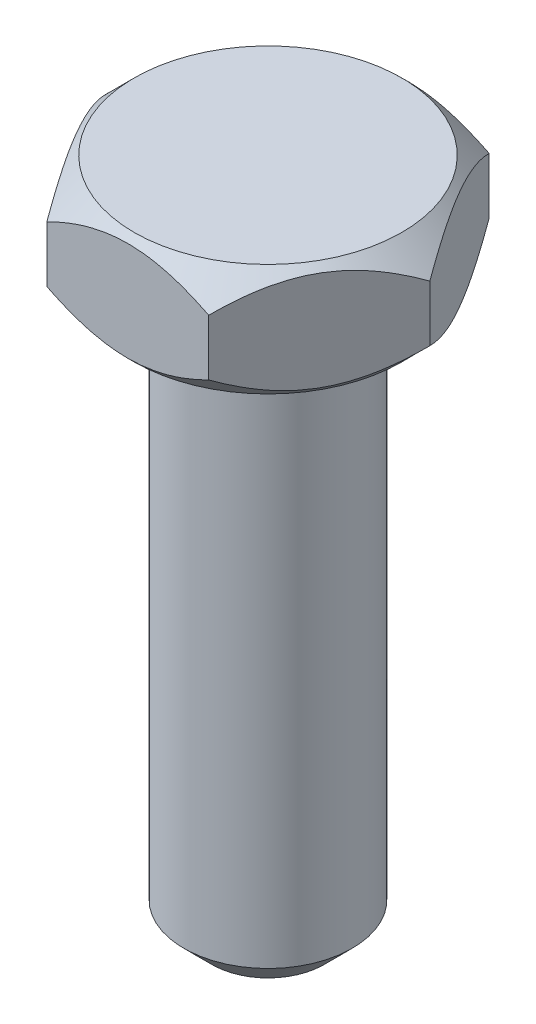
ISO-10303-21;
HEADER;
FILE_DESCRIPTION(('STEP AP214'),'2;1');
FILE_NAME('part.step','',(''),(''),'','','');
FILE_SCHEMA(('AUTOMOTIVE_DESIGN { 1 0 10303 214 1 1 1 1 }'));
ENDSEC;
DATA;
#1=APPLICATION_CONTEXT('core data for automotive mechanical design processes');
#2=APPLICATION_PROTOCOL_DEFINITION('international standard','automotive_design',2000,#1);
#3=PRODUCT_CONTEXT('',#1,'mechanical');
#4=PRODUCT('Part','Part','',(#3));
#5=PRODUCT_RELATED_PRODUCT_CATEGORY('part','',(#4));
#6=PRODUCT_DEFINITION_FORMATION('','',#4);
#7=PRODUCT_DEFINITION_CONTEXT('part definition',#1,'design');
#8=PRODUCT_DEFINITION('design','',#6,#7);
#9=PRODUCT_DEFINITION_SHAPE('','',#8);
#10=(LENGTH_UNIT() NAMED_UNIT(*) SI_UNIT(.MILLI.,.METRE.));
#11=(NAMED_UNIT(*) PLANE_ANGLE_UNIT() SI_UNIT($,.RADIAN.));
#12=(NAMED_UNIT(*) SI_UNIT($,.STERADIAN.) SOLID_ANGLE_UNIT());
#13=UNCERTAINTY_MEASURE_WITH_UNIT(LENGTH_MEASURE(1.E-05),#10,'distance_accuracy_value','');
#14=(GEOMETRIC_REPRESENTATION_CONTEXT(3) GLOBAL_UNCERTAINTY_ASSIGNED_CONTEXT((#13)) GLOBAL_UNIT_ASSIGNED_CONTEXT((#10,
#11,#12)) REPRESENTATION_CONTEXT('',''));
#15=CARTESIAN_POINT('',(0.,0.,0.));
#16=DIRECTION('',(0.,0.,1.));
#17=DIRECTION('',(1.,0.,0.));
#18=AXIS2_PLACEMENT_3D('',#15,#16,#17);
#19=CARTESIAN_POINT('',(-2.88675134594812,-4.,-4.99999999999999));
#20=DIRECTION('',(0.,-1.,0.));
#21=DIRECTION('',(0.,0.,-1.));
#22=AXIS2_PLACEMENT_3D('',#19,#20,#21);
#23=PLANE('',#22);
#24=CARTESIAN_POINT('',(0.,-4.,0.));
#25=DIRECTION('',(0.,1.,0.));
#26=DIRECTION('',(0.,0.,1.));
#27=AXIS2_PLACEMENT_3D('',#24,#25,#26);
#28=CIRCLE('',#27,4.77350269189625);
#29=CARTESIAN_POINT('',(0.,-4.,4.77350269189625));
#30=VERTEX_POINT('',#29);
#31=EDGE_CURVE('E101',#30,#30,#28,.T.);
#32=ORIENTED_EDGE('',*,*,#31,.F.);
#33=EDGE_LOOP('',(#32));
#34=FACE_BOUND('',#33,.T.);
#35=CARTESIAN_POINT('',(0.,-4.,0.));
#36=DIRECTION('',(0.,-1.,0.));
#37=DIRECTION('',(0.,0.,-1.));
#38=AXIS2_PLACEMENT_3D('',#35,#36,#37);
#39=CIRCLE('',#38,3.);
#40=CARTESIAN_POINT('',(0.,-4.,-3.));
#41=VERTEX_POINT('',#40);
#42=EDGE_CURVE('E115',#41,#41,#39,.T.);
#43=ORIENTED_EDGE('',*,*,#42,.F.);
#44=EDGE_LOOP('',(#43));
#45=FACE_BOUND('',#44,.T.);
#46=ADVANCED_FACE('F28',(#34,#45),#23,.T.);
#47=CARTESIAN_POINT('',(0.,-24.,0.));
#48=DIRECTION('',(0.,1.,0.));
#49=DIRECTION('',(0.,0.,1.));
#50=AXIS2_PLACEMENT_3D('',#47,#48,#49);
#51=CYLINDRICAL_SURFACE('',#50,3.);
#52=CARTESIAN_POINT('',(0.,-23.,0.));
#53=DIRECTION('',(0.,-1.,0.));
#54=DIRECTION('',(0.,0.,-1.));
#55=AXIS2_PLACEMENT_3D('',#52,#53,#54);
#56=CIRCLE('',#55,3.);
#57=CARTESIAN_POINT('',(0.,-23.,-3.));
#58=VERTEX_POINT('',#57);
#59=EDGE_CURVE('E41',#58,#58,#56,.F.);
#60=ORIENTED_EDGE('',*,*,#59,.T.);
#61=EDGE_LOOP('',(#60));
#62=FACE_BOUND('',#61,.T.);
#63=ORIENTED_EDGE('',*,*,#42,.T.);
#64=EDGE_LOOP('',(#63));
#65=FACE_BOUND('',#64,.T.);
#66=ADVANCED_FACE('F122',(#62,#65),#51,.T.);
#67=CARTESIAN_POINT('',(0.,-24.,0.));
#68=DIRECTION('',(0.,-1.,0.));
#69=DIRECTION('',(0.,0.,-1.));
#70=AXIS2_PLACEMENT_3D('',#67,#68,#69);
#71=PLANE('',#70);
#72=CARTESIAN_POINT('',(0.,-24.,0.));
#73=DIRECTION('',(0.,-1.,0.));
#74=DIRECTION('',(0.,0.,-1.));
#75=AXIS2_PLACEMENT_3D('',#72,#73,#74);
#76=CIRCLE('',#75,2.00000000000001);
#77=CARTESIAN_POINT('',(0.,-24.,-2.00000000000001));
#78=VERTEX_POINT('',#77);
#79=EDGE_CURVE('E116',#78,#78,#76,.T.);
#80=ORIENTED_EDGE('',*,*,#79,.T.);
#81=EDGE_LOOP('',(#80));
#82=FACE_BOUND('',#81,.T.);
#83=ADVANCED_FACE('F128',(#82),#71,.T.);
#84=CARTESIAN_POINT('',(0.,-24.,0.));
#85=DIRECTION('',(0.,1.,0.));
#86=DIRECTION('',(0.,0.,1.));
#87=AXIS2_PLACEMENT_3D('',#84,#85,#86);
#88=CONICAL_SURFACE('',#87,2.00000000000001,0.785398163397447);
#89=ORIENTED_EDGE('',*,*,#59,.F.);
#90=EDGE_LOOP('',(#89));
#91=FACE_BOUND('',#90,.T.);
#92=ORIENTED_EDGE('',*,*,#79,.F.);
#93=EDGE_LOOP('',(#92));
#94=FACE_BOUND('',#93,.T.);
#95=ADVANCED_FACE('F125',(#91,#94),#88,.T.);
#96=CARTESIAN_POINT('',(0.,-4.,0.));
#97=DIRECTION('',(0.,1.,0.));
#98=DIRECTION('',(0.,0.,1.));
#99=AXIS2_PLACEMENT_3D('',#96,#97,#98);
#100=CONICAL_SURFACE('',#99,4.77350269189625,0.785398163397448);
#101=CARTESIAN_POINT('',(-5.77361816195009,-2.99988452648213,0.000200000000039932));
#102=CARTESIAN_POINT('',(-5.72398176110225,-3.04951645439574,-0.0857727681732672));
#103=CARTESIAN_POINT('',(-5.6739638280717,-3.0976252747131,-0.172406369471769));
#104=CARTESIAN_POINT('',(-5.57309004377303,-3.19033336867022,-0.3471248890288));
#105=CARTESIAN_POINT('',(-5.52223375293569,-3.23493072549852,-0.435210568643571));
#106=CARTESIAN_POINT('',(-5.36782257743899,-3.36314092787175,-0.702658569860293));
#107=CARTESIAN_POINT('',(-5.26296050943971,-3.44062493449848,-0.884284999421792));
#108=CARTESIAN_POINT('',(-5.05149774994706,-3.57331105557449,-1.25054924277179));
#109=CARTESIAN_POINT('',(-4.94495110937142,-3.62884745935417,-1.43509343762457));
#110=CARTESIAN_POINT('',(-4.78337944338746,-3.69308950595249,-1.71494377217234));
#111=CARTESIAN_POINT('',(-4.72928433986568,-3.71131783666137,-1.80863923991277));
#112=CARTESIAN_POINT('',(-4.62063609179559,-3.74100781287389,-1.9968235257235));
#113=CARTESIAN_POINT('',(-4.56608301694085,-3.75247046969492,-2.09131222308102));
#114=CARTESIAN_POINT('',(-4.43314578685872,-3.77168913825403,-2.32156625980075));
#115=CARTESIAN_POINT('',(-4.35461839928598,-3.7757217117403,-2.4575796848624));
#116=CARTESIAN_POINT('',(-4.19770514602325,-3.7689541458947,-2.72936141189436));
#117=CARTESIAN_POINT('',(-4.11931933958609,-3.75814880702901,-2.86512961123579));
#118=CARTESIAN_POINT('',(-3.96328672226451,-3.72234235010197,-3.13538603207472));
#119=CARTESIAN_POINT('',(-3.88564083675503,-3.69732535604175,-3.26987265077581));
#120=CARTESIAN_POINT('',(-3.73168360440634,-3.63445567501058,-3.53653439939643));
#121=CARTESIAN_POINT('',(-3.65537215571136,-3.59660397223245,-3.66870970573533));
#122=CARTESIAN_POINT('',(-3.51990355411976,-3.51873011323948,-3.90334820652228));
#123=CARTESIAN_POINT('',(-3.4604464736886,-3.480755749581,-4.00633089069876));
#124=CARTESIAN_POINT('',(-3.34259967462161,-3.39868737382607,-4.21044753419214));
#125=CARTESIAN_POINT('',(-3.28420998845894,-3.35459317589646,-4.31158143726389));
#126=CARTESIAN_POINT('',(-3.16868188148908,-3.26127361464765,-4.51168198823795));
#127=CARTESIAN_POINT('',(-3.11154017495448,-3.21206438729062,-4.61065432718707));
#128=CARTESIAN_POINT('',(-2.99831490663731,-3.109160877157,-4.80676624461303));
#129=CARTESIAN_POINT('',(-2.94223072132828,-3.05546934545098,-4.90390690306937));
#130=CARTESIAN_POINT('',(-2.88663587589429,-2.99988452648214,-5.00019999999999));
#131=B_SPLINE_CURVE_WITH_KNOTS('',3,(#101,#102,#103,#104,#105,#106,#107,#108,#109,#110,#111,
#112,#113,#114,#115,#116,#117,#118,#119,#120,#121,#122,#123,#124,#125,#126,#127,#128,#129,#130),
.UNSPECIFIED.,.F.,.F.,(4,2,2,2,2,2,2,2,2,2,2,2,2,2,4),(0.,0.332945616209569,0.666071736106993,
1.33592065243335,1.99513262597482,2.32409207808825,2.65300234563692,3.12358963991984,
3.59434188052354,4.06562104077027,4.5368640704961,4.91117956742317,5.28550643319671,
5.65868635377117,6.03163889109475),.UNSPECIFIED.);
#132=CARTESIAN_POINT('',(-5.77350269189625,-3.,0.));
#133=VERTEX_POINT('',#132);
#134=CARTESIAN_POINT('',(-2.88675134594813,-3.,-4.99999999999999));
#135=VERTEX_POINT('',#134);
#136=EDGE_CURVE('E173',#133,#135,#131,.T.);
#137=ORIENTED_EDGE('',*,*,#136,.T.);
#138=CARTESIAN_POINT('',(-5.93336867910423,-1.0143233614403,-4.99999999999999));
#139=CARTESIAN_POINT('',(-5.78966341948587,-1.1241885817879,-4.99999999999999));
#140=CARTESIAN_POINT('',(-5.64517359422455,-1.23304389822759,-4.99999999999999));
#141=CARTESIAN_POINT('',(-5.35430787651161,-1.44827641705777,-4.99999999999999));
#142=CARTESIAN_POINT('',(-5.20793153723386,-1.55465301495845,-4.99999999999999));
#143=CARTESIAN_POINT('',(-4.9119053610751,-1.76522692025996,-4.99999999999999));
#144=CARTESIAN_POINT('',(-4.7622389674382,-1.86940102910427,-4.99999999999999));
#145=CARTESIAN_POINT('',(-4.4603979301907,-2.07403749362642,-4.99999999999999));
#146=CARTESIAN_POINT('',(-4.30822346176151,-2.17450010696542,-4.99999999999999));
#147=CARTESIAN_POINT('',(-3.99153933620166,-2.37689028562685,-4.99999999999999));
#148=CARTESIAN_POINT('',(-3.82684512877714,-2.47853053625136,-4.99999999999999));
#149=CARTESIAN_POINT('',(-3.49359569305951,-2.67537782448448,-4.99999999999999));
#150=CARTESIAN_POINT('',(-3.32503983391761,-2.77058380079454,-4.99999999999999));
#151=CARTESIAN_POINT('',(-2.98404180965613,-2.95252582018176,-4.99999999999999));
#152=CARTESIAN_POINT('',(-2.81161302726992,-3.03928674909056,-4.99999999999999));
#153=CARTESIAN_POINT('',(-2.4619377508861,-3.20239520740955,-4.99999999999999));
#154=CARTESIAN_POINT('',(-2.28469354573479,-3.27874758379917,-4.99999999999999));
#155=CARTESIAN_POINT('',(-1.94171568558995,-3.41181755173878,-4.99999999999999));
#156=CARTESIAN_POINT('',(-1.77643834256962,-3.46969922851381,-4.99999999999999));
#157=CARTESIAN_POINT('',(-1.44175059438624,-3.57222452709261,-4.99999999999999));
#158=CARTESIAN_POINT('',(-1.27233991994473,-3.61686728390092,-4.99999999999999));
#159=CARTESIAN_POINT('',(-0.933301891878295,-3.68978435588989,-4.99999999999999));
#160=CARTESIAN_POINT('',(-0.763738295172394,-3.71835018807338,-4.99999999999999));
#161=CARTESIAN_POINT('',(-0.422603458667702,-3.75853073066782,-4.99999999999999));
#162=CARTESIAN_POINT('',(-0.251032616590633,-3.7701487436941,-4.99999999999999));
#163=CARTESIAN_POINT('',(0.0853406388539587,-3.77548648250807,-4.99999999999999));
#164=CARTESIAN_POINT('',(0.250131876658651,-3.76992113564033,-4.99999999999999));
#165=CARTESIAN_POINT('',(0.578387101858167,-3.74282076274746,-4.99999999999999));
#166=CARTESIAN_POINT('',(0.741850964252608,-3.72128424993436,-4.99999999999999));
#167=CARTESIAN_POINT('',(1.06903592592894,-3.66307865086045,-4.99999999999999));
#168=CARTESIAN_POINT('',(1.23270929845992,-3.62614570544629,-4.99999999999999));
#169=CARTESIAN_POINT('',(1.55646565066118,-3.53916921466345,-4.99999999999999));
#170=CARTESIAN_POINT('',(1.71654886698276,-3.48912653621913,-4.99999999999999));
#171=CARTESIAN_POINT('',(2.04376834721888,-3.37425220624934,-4.99999999999999));
#172=CARTESIAN_POINT('',(2.21062650526836,-3.30863700466564,-4.99999999999999));
#173=CARTESIAN_POINT('',(2.54003854131556,-3.16728810798752,-4.99999999999999));
#174=CARTESIAN_POINT('',(2.7025904176521,-3.0915498029936,-4.99999999999999));
#175=CARTESIAN_POINT('',(3.02416565802373,-2.9317524021677,-4.99999999999999));
#176=CARTESIAN_POINT('',(3.1831761026048,-2.84766751767455,-4.99999999999999));
#177=CARTESIAN_POINT('',(3.49754870709798,-2.67302987151769,-4.99999999999999));
#178=CARTESIAN_POINT('',(3.65291142946937,-2.58247811583028,-4.99999999999999));
#179=CARTESIAN_POINT('',(3.95285892432341,-2.40078159251411,-4.99999999999999));
#180=CARTESIAN_POINT('',(4.09759659911003,-2.30988790532247,-4.99999999999999));
#181=CARTESIAN_POINT('',(4.38458573992774,-2.12424528238796,-4.99999999999999));
#182=CARTESIAN_POINT('',(4.52683701776728,-2.02949605661616,-4.99999999999999));
#183=CARTESIAN_POINT('',(4.80803186770968,-1.83760520698688,-4.99999999999999));
#184=CARTESIAN_POINT('',(4.94699285705844,-1.74048901451515,-4.99999999999999));
#185=CARTESIAN_POINT('',(5.22301057132508,-1.54366358089935,-4.99999999999999));
#186=CARTESIAN_POINT('',(5.36006781033932,-1.44395506153837,-4.99999999999999));
#187=CARTESIAN_POINT('',(5.49632687048856,-1.34318580314552,-4.99999999999999));
#188=B_SPLINE_CURVE_WITH_KNOTS('',3,(#138,#139,#140,#141,#142,#143,#144,#145,#146,#147,#148,
#149,#150,#151,#152,#153,#154,#155,#156,#157,#158,#159,#160,#161,#162,#163,#164,#165,#166,#167,
#168,#169,#170,#171,#172,#173,#174,#175,#176,#177,#178,#179,#180,#181,#182,#183,#184,#185,#186,
#187),.UNSPECIFIED.,.F.,.F.,(4,2,2,2,2,2,2,2,2,2,2,2,2,2,2,2,2,2,2,2,2,2,2,2,4),(0.,
0.542683335711663,1.08549766009344,1.63250741832322,2.17947913015188,2.75996048819956,
3.34053736097748,3.91934802264124,4.49788822043794,5.02279153401111,5.54772913580436,
6.06281331680062,6.57779711011592,7.0716474990381,7.56554386725873,8.06827708076712,
8.57097705777059,9.10845041736518,9.6461693729829,10.1856047538602,10.7249564030361,
11.2376185039342,11.7503192408631,12.2588884723274,12.7673175877714),.UNSPECIFIED.);
#189=CARTESIAN_POINT('',(2.88675134594814,-3.,-4.99999999999999));
#190=VERTEX_POINT('',#189);
#191=EDGE_CURVE('E167',#135,#190,#188,.T.);
#192=ORIENTED_EDGE('',*,*,#191,.T.);
#193=CARTESIAN_POINT('',(2.8866358758943,-2.99988452648213,-5.00019999999999));
#194=CARTESIAN_POINT('',(2.93627227674214,-3.04951645439574,-4.91422723182668));
#195=CARTESIAN_POINT('',(2.98629020977269,-3.09762527471309,-4.82759363052818));
#196=CARTESIAN_POINT('',(3.08716399407136,-3.19033336867022,-4.65287511097115));
#197=CARTESIAN_POINT('',(3.1380202849087,-3.23493072549851,-4.56478943135638));
#198=CARTESIAN_POINT('',(3.2924314604054,-3.36314092787174,-4.29734143013966));
#199=CARTESIAN_POINT('',(3.39729352840468,-3.44062493449848,-4.11571500057816));
#200=CARTESIAN_POINT('',(3.60875628789733,-3.57331105557448,-3.74945075722817));
#201=CARTESIAN_POINT('',(3.71530292847297,-3.62884745935416,-3.56490656237539));
#202=CARTESIAN_POINT('',(3.87687459445693,-3.69308950595248,-3.28505622782762));
#203=CARTESIAN_POINT('',(3.93096969797871,-3.71131783666136,-3.1913607600872));
#204=CARTESIAN_POINT('',(4.03961794604879,-3.74100781287387,-3.00317647427646));
#205=CARTESIAN_POINT('',(4.09417102090353,-3.75247046969491,-2.90868777691894));
#206=CARTESIAN_POINT('',(4.22710825098566,-3.77168913825401,-2.67843374019922));
#207=CARTESIAN_POINT('',(4.30563563855841,-3.77572171174028,-2.54242031513757));
#208=CARTESIAN_POINT('',(4.46254889182113,-3.76895414589469,-2.2706385881056));
#209=CARTESIAN_POINT('',(4.5409346982583,-3.758148807029,-2.13487038876418));
#210=CARTESIAN_POINT('',(4.69696731557988,-3.72234235010196,-1.86461396792524));
#211=CARTESIAN_POINT('',(4.77461320108935,-3.69732535604173,-1.73012734922416));
#212=CARTESIAN_POINT('',(4.92857043343804,-3.63445567501056,-1.46346560060354));
#213=CARTESIAN_POINT('',(5.00488188213303,-3.59660397223244,-1.33129029426463));
#214=CARTESIAN_POINT('',(5.14035048372462,-3.51873011323946,-1.09665179347769));
#215=CARTESIAN_POINT('',(5.19980756415579,-3.48075574958098,-0.993669109301199));
#216=CARTESIAN_POINT('',(5.31765436322278,-3.39868737382605,-0.789552465807816));
#217=CARTESIAN_POINT('',(5.37604404938545,-3.35459317589644,-0.688418562736065));
#218=CARTESIAN_POINT('',(5.49157215635532,-3.26127361464763,-0.488318011762002));
#219=CARTESIAN_POINT('',(5.54871386288992,-3.2120643872906,-0.389345672812883));
#220=CARTESIAN_POINT('',(5.66193913120709,-3.10916087715698,-0.193233755386925));
#221=CARTESIAN_POINT('',(5.71802331651611,-3.05546934545096,-0.0960930969305828));
#222=CARTESIAN_POINT('',(5.77361816195011,-2.99988452648211,0.000200000000038399));
#223=B_SPLINE_CURVE_WITH_KNOTS('',3,(#193,#194,#195,#196,#197,#198,#199,#200,#201,#202,#203,
#204,#205,#206,#207,#208,#209,#210,#211,#212,#213,#214,#215,#216,#217,#218,#219,#220,#221,#222),
.UNSPECIFIED.,.F.,.F.,(4,2,2,2,2,2,2,2,2,2,2,2,2,2,4),(0.,0.332945616209567,0.666071736106988,
1.33592065243334,1.99513262597481,2.32409207808823,2.6530023456369,3.12358963991982,
3.59434188052352,4.06562104077025,4.53686407049609,4.91117956742316,5.2855064331967,
5.65868635377117,6.03163889109475),.UNSPECIFIED.);
#224=CARTESIAN_POINT('',(5.77350269189625,-3.,0.));
#225=VERTEX_POINT('',#224);
#226=EDGE_CURVE('E89',#190,#225,#223,.T.);
#227=ORIENTED_EDGE('',*,*,#226,.T.);
#228=CARTESIAN_POINT('',(5.77361816195011,-2.99988452648211,-0.000199999999961442));
#229=CARTESIAN_POINT('',(5.72398176110227,-3.04951645439572,0.0857727681733448));
#230=CARTESIAN_POINT('',(5.67396382807171,-3.09762527471308,0.172406369471846));
#231=CARTESIAN_POINT('',(5.57309004377305,-3.1903333686702,0.347124889028875));
#232=CARTESIAN_POINT('',(5.52223375293571,-3.23493072549849,0.435210568643645));
#233=CARTESIAN_POINT('',(5.36782257743901,-3.36314092787172,0.702658569860364));
#234=CARTESIAN_POINT('',(5.26296050943973,-3.44062493449846,0.884284999421861));
#235=CARTESIAN_POINT('',(5.05149774994707,-3.57331105557446,1.25054924277185));
#236=CARTESIAN_POINT('',(4.94495110937144,-3.62884745935414,1.43509343762464));
#237=CARTESIAN_POINT('',(4.78337944338747,-3.69308950595246,1.7149437721724));
#238=CARTESIAN_POINT('',(4.72928433986569,-3.71131783666134,1.80863923991283));
#239=CARTESIAN_POINT('',(4.62063609179561,-3.74100781287385,1.99682352572356));
#240=CARTESIAN_POINT('',(4.56608301694086,-3.75247046969489,2.09131222308108));
#241=CARTESIAN_POINT('',(4.43314578685873,-3.77168913825399,2.3215662598008));
#242=CARTESIAN_POINT('',(4.35461839928599,-3.77572171174026,2.45757968486245));
#243=CARTESIAN_POINT('',(4.19770514602326,-3.76895414589467,2.72936141189442));
#244=CARTESIAN_POINT('',(4.11931933958609,-3.75814880702898,2.86512961123584));
#245=CARTESIAN_POINT('',(3.96328672226451,-3.72234235010194,3.13538603207478));
#246=CARTESIAN_POINT('',(3.88564083675503,-3.69732535604171,3.26987265077586));
#247=CARTESIAN_POINT('',(3.73168360440634,-3.63445567501054,3.53653439939648));
#248=CARTESIAN_POINT('',(3.65537215571135,-3.59660397223242,3.66870970573539));
#249=CARTESIAN_POINT('',(3.51990355411976,-3.51873011323944,3.90334820652233));
#250=CARTESIAN_POINT('',(3.4604464736886,-3.48075574958096,4.00633089069881));
#251=CARTESIAN_POINT('',(3.34259967462161,-3.39868737382603,4.21044753419218));
#252=CARTESIAN_POINT('',(3.28420998845894,-3.35459317589643,4.31158143726393));
#253=CARTESIAN_POINT('',(3.16868188148908,-3.26127361464762,4.51168198823798));
#254=CARTESIAN_POINT('',(3.11154017495448,-3.21206438729059,4.6106543271871));
#255=CARTESIAN_POINT('',(2.99831490663731,-3.10916087715698,4.80676624461305));
#256=CARTESIAN_POINT('',(2.94223072132829,-3.05546934545097,4.90390690306938));
#257=CARTESIAN_POINT('',(2.8866358758943,-2.99988452648212,5.0002));
#258=B_SPLINE_CURVE_WITH_KNOTS('',3,(#228,#229,#230,#231,#232,#233,#234,#235,#236,#237,#238,
#239,#240,#241,#242,#243,#244,#245,#246,#247,#248,#249,#250,#251,#252,#253,#254,#255,#256,#257),
.UNSPECIFIED.,.F.,.F.,(4,2,2,2,2,2,2,2,2,2,2,2,2,2,4),(0.,0.332945616209566,0.666071736106988,
1.33592065243334,1.99513262597481,2.32409207808823,2.6530023456369,3.12358963991982,
3.59434188052352,4.06562104077025,4.53686407049609,4.91117956742315,5.28550643319668,
5.65868635377112,6.03163889109469),.UNSPECIFIED.);
#259=CARTESIAN_POINT('',(2.88675134594812,-3.,5.));
#260=VERTEX_POINT('',#259);
#261=EDGE_CURVE('E85',#225,#260,#258,.T.);
#262=ORIENTED_EDGE('',*,*,#261,.T.);
#263=CARTESIAN_POINT('',(-5.93336867913979,-1.01432336141309,5.));
#264=CARTESIAN_POINT('',(-5.78966341952042,-1.12418858176174,5.));
#265=CARTESIAN_POINT('',(-5.64517359425807,-1.23304389820249,5.));
#266=CARTESIAN_POINT('',(-5.35430787654308,-1.44827641703476,5.));
#267=CARTESIAN_POINT('',(-5.20793153726431,-1.55465301493648,5.));
#268=CARTESIAN_POINT('',(-4.91190536110345,-1.76522692024009,5.));
#269=CARTESIAN_POINT('',(-4.76223896746549,-1.86940102908545,5.));
#270=CARTESIAN_POINT('',(-4.46039793021584,-2.07403749360968,5.));
#271=CARTESIAN_POINT('',(-4.30822346178556,-2.17450010694972,5.));
#272=CARTESIAN_POINT('',(-3.99153933622337,-2.37689028561331,5.));
#273=CARTESIAN_POINT('',(-3.82684512879759,-2.47853053623893,5.));
#274=CARTESIAN_POINT('',(-3.49359569307741,-2.67537782447423,5.));
#275=CARTESIAN_POINT('',(-3.3250398339342,-2.77058380078537,5.));
#276=CARTESIAN_POINT('',(-2.98404180967006,-2.95252582017463,5.));
#277=CARTESIAN_POINT('',(-2.81161302728251,-3.0392867490844,5.));
#278=CARTESIAN_POINT('',(-2.46193775089592,-3.20239520740523,5.));
#279=CARTESIAN_POINT('',(-2.28469354574318,-3.2787475837957,5.));
#280=CARTESIAN_POINT('',(-1.94171568559774,-3.41181755173593,5.));
#281=CARTESIAN_POINT('',(-1.7764383425783,-3.46969922851087,5.));
#282=CARTESIAN_POINT('',(-1.44175059439672,-3.57222452708967,5.));
#283=CARTESIAN_POINT('',(-1.27233991995613,-3.61686728389806,5.));
#284=CARTESIAN_POINT('',(-0.933301891891501,-3.68978435588743,5.));
#285=CARTESIAN_POINT('',(-0.763738295186488,-3.71835018807121,5.));
#286=CARTESIAN_POINT('',(-0.422603458683547,-3.75853073066644,5.));
#287=CARTESIAN_POINT('',(-0.251032616607341,-3.77014874369322,5.));
#288=CARTESIAN_POINT('',(0.0853406388357404,-3.77548648250835,5.));
#289=CARTESIAN_POINT('',(0.250131876639783,-3.76992113564124,5.));
#290=CARTESIAN_POINT('',(0.57838710183807,-3.74282076274974,5.));
#291=CARTESIAN_POINT('',(0.741850964231932,-3.72128424993737,5.));
#292=CARTESIAN_POINT('',(1.06903592590712,-3.66307865086499,5.));
#293=CARTESIAN_POINT('',(1.23270929843754,-3.62614570545163,5.));
#294=CARTESIAN_POINT('',(1.55646565063773,-3.5391692146704,5.));
#295=CARTESIAN_POINT('',(1.71654886695881,-3.4891265362269,5.));
#296=CARTESIAN_POINT('',(2.04376834719211,-3.3742522062594,5.));
#297=CARTESIAN_POINT('',(2.21062650523935,-3.30863700467733,5.));
#298=CARTESIAN_POINT('',(2.54003854128215,-3.16728810800261,5.));
#299=CARTESIAN_POINT('',(2.70259041761655,-3.09154980301047,5.));
#300=CARTESIAN_POINT('',(3.02416565798398,-2.93175240218824,5.));
#301=CARTESIAN_POINT('',(3.18317610256299,-2.84766751769698,5.));
#302=CARTESIAN_POINT('',(3.49754870705211,-2.67302987154396,5.));
#303=CARTESIAN_POINT('',(3.65291142942151,-2.58247811585849,5.));
#304=CARTESIAN_POINT('',(3.95285892427193,-2.40078159254602,5.));
#305=CARTESIAN_POINT('',(4.09759659905692,-2.30988790535612,5.));
#306=CARTESIAN_POINT('',(4.38458573987138,-2.1242452824251,5.));
#307=CARTESIAN_POINT('',(4.52683701770932,-2.02949605665505,5.));
#308=CARTESIAN_POINT('',(4.80803186764853,-1.83760520702925,5.));
#309=CARTESIAN_POINT('',(4.94699285699572,-1.74048901455926,5.));
#310=CARTESIAN_POINT('',(5.22301057125923,-1.54366358094691,5.));
#311=CARTESIAN_POINT('',(5.3600678102719,-1.44395506158766,5.));
#312=CARTESIAN_POINT('',(5.49632687041958,-1.34318580319653,5.));
#313=B_SPLINE_CURVE_WITH_KNOTS('',3,(#263,#264,#265,#266,#267,#268,#269,#270,#271,#272,#273,
#274,#275,#276,#277,#278,#279,#280,#281,#282,#283,#284,#285,#286,#287,#288,#289,#290,#291,#292,
#293,#294,#295,#296,#297,#298,#299,#300,#301,#302,#303,#304,#305,#306,#307,#308,#309,#310,#311,
#312),.UNSPECIFIED.,.F.,.F.,(4,2,2,2,2,2,2,2,2,2,2,2,2,2,2,2,2,2,2,2,2,2,2,2,4),(0.,
0.542683335716004,1.08549766010212,1.63250741833633,2.17947913016941,2.75996048822206,
3.34053736100496,3.91934802267365,4.49788822047528,5.02279153404586,5.54772913583653,
6.06281331683033,6.57779711014315,7.07164749906334,7.56554386728196,8.06827708078817,
8.57097705778948,9.108450417376,9.64616937298566,10.1856047538548,10.7249564030226,
11.2376185039138,11.7503192408357,12.2588884722932,12.7673175877304),.UNSPECIFIED.);
#314=CARTESIAN_POINT('',(-2.88675134594811,-3.,5.));
#315=VERTEX_POINT('',#314);
#316=EDGE_CURVE('E47',#260,#315,#313,.F.);
#317=ORIENTED_EDGE('',*,*,#316,.T.);
#318=CARTESIAN_POINT('',(-2.88663587589427,-2.99988452648213,5.0002));
#319=CARTESIAN_POINT('',(-2.93627227674211,-3.04951645439574,4.9142272318267));
#320=CARTESIAN_POINT('',(-2.98629020977267,-3.0976252747131,4.82759363052819));
#321=CARTESIAN_POINT('',(-3.08716399407133,-3.19033336867022,4.65287511097117));
#322=CARTESIAN_POINT('',(-3.13802028490867,-3.23493072549851,4.5647894313564));
#323=CARTESIAN_POINT('',(-3.29243146040537,-3.36314092787174,4.29734143013968));
#324=CARTESIAN_POINT('',(-3.39729352840465,-3.44062493449848,4.11571500057818));
#325=CARTESIAN_POINT('',(-3.60875628789731,-3.57331105557448,3.74945075722819));
#326=CARTESIAN_POINT('',(-3.71530292847294,-3.62884745935416,3.56490656237541));
#327=CARTESIAN_POINT('',(-3.8768745944569,-3.69308950595248,3.28505622782764));
#328=CARTESIAN_POINT('',(-3.93096969797869,-3.71131783666136,3.19136076008722));
#329=CARTESIAN_POINT('',(-4.03961794604877,-3.74100781287387,3.00317647427649));
#330=CARTESIAN_POINT('',(-4.09417102090351,-3.75247046969491,2.90868777691897));
#331=CARTESIAN_POINT('',(-4.22710825098564,-3.77168913825401,2.67843374019925));
#332=CARTESIAN_POINT('',(-4.30563563855839,-3.77572171174028,2.5424203151376));
#333=CARTESIAN_POINT('',(-4.46254889182112,-3.76895414589469,2.27063858810563));
#334=CARTESIAN_POINT('',(-4.54093469825828,-3.758148807029,2.13487038876421));
#335=CARTESIAN_POINT('',(-4.69696731557987,-3.72234235010196,1.86461396792528));
#336=CARTESIAN_POINT('',(-4.77461320108934,-3.69732535604173,1.73012734922419));
#337=CARTESIAN_POINT('',(-4.92857043343803,-3.63445567501056,1.46346560060357));
#338=CARTESIAN_POINT('',(-5.00488188213302,-3.59660397223243,1.33129029426467));
#339=CARTESIAN_POINT('',(-5.14035048372461,-3.51873011323946,1.09665179347773));
#340=CARTESIAN_POINT('',(-5.19980756415578,-3.48075574958098,0.993669109301244));
#341=CARTESIAN_POINT('',(-5.31765436322276,-3.39868737382605,0.789552465807868));
#342=CARTESIAN_POINT('',(-5.37604404938544,-3.35459317589644,0.68841856273612));
#343=CARTESIAN_POINT('',(-5.4915721563553,-3.26127361464764,0.488318011762065));
#344=CARTESIAN_POINT('',(-5.5487138628899,-3.21206438729061,0.389345672812949));
#345=CARTESIAN_POINT('',(-5.66193913120707,-3.10916087715699,0.193233755386997));
#346=CARTESIAN_POINT('',(-5.71802331651609,-3.05546934545098,0.0960930969306575));
#347=CARTESIAN_POINT('',(-5.77361816195009,-2.99988452648213,-0.000199999999960452));
#348=B_SPLINE_CURVE_WITH_KNOTS('',3,(#318,#319,#320,#321,#322,#323,#324,#325,#326,#327,#328,
#329,#330,#331,#332,#333,#334,#335,#336,#337,#338,#339,#340,#341,#342,#343,#344,#345,#346,#347),
.UNSPECIFIED.,.F.,.F.,(4,2,2,2,2,2,2,2,2,2,2,2,2,2,4),(0.,0.332945616209565,0.666071736106984,
1.33592065243333,1.9951326259748,2.32409207808822,2.65300234563688,3.12358963991981,
3.59434188052351,4.06562104077024,4.53686407049607,4.91117956742313,5.28550643319667,
5.65868635377112,6.03163889109469),.UNSPECIFIED.);
#349=EDGE_CURVE('E11',#315,#133,#348,.T.);
#350=ORIENTED_EDGE('',*,*,#349,.T.);
#351=EDGE_LOOP('',(#137,#192,#227,#262,#317,#350));
#352=FACE_BOUND('',#351,.T.);
#353=ORIENTED_EDGE('',*,*,#31,.T.);
#354=EDGE_LOOP('',(#353));
#355=FACE_BOUND('',#354,.T.);
#356=ADVANCED_FACE('F86',(#352,#355),#100,.T.);
#357=CARTESIAN_POINT('',(-2.88675134594812,0.,-4.99999999999999));
#358=DIRECTION('',(0.,-1.,0.));
#359=DIRECTION('',(0.,0.,-1.));
#360=AXIS2_PLACEMENT_3D('',#357,#358,#359);
#361=PLANE('',#360);
#362=CARTESIAN_POINT('',(0.,0.,0.));
#363=DIRECTION('',(0.,1.,0.));
#364=DIRECTION('',(0.,0.,1.));
#365=AXIS2_PLACEMENT_3D('',#362,#363,#364);
#366=CIRCLE('',#365,4.77350269189625);
#367=CARTESIAN_POINT('',(0.,0.,4.77350269189625));
#368=VERTEX_POINT('',#367);
#369=EDGE_CURVE('E233',#368,#368,#366,.T.);
#370=ORIENTED_EDGE('',*,*,#369,.T.);
#371=EDGE_LOOP('',(#370));
#372=FACE_BOUND('',#371,.T.);
#373=ADVANCED_FACE('F148',(#372),#361,.F.);
#374=CARTESIAN_POINT('',(0.,-1.,0.));
#375=DIRECTION('',(0.,-1.,0.));
#376=DIRECTION('',(0.,0.,-1.));
#377=AXIS2_PLACEMENT_3D('',#374,#375,#376);
#378=CONICAL_SURFACE('',#377,5.77350269189625,0.785398163397448);
#379=CARTESIAN_POINT('',(-2.88663587589429,-1.00011547351786,-5.00019999999999));
#380=CARTESIAN_POINT('',(-2.93627227674212,-0.950483545604256,-4.91422723182668));
#381=CARTESIAN_POINT('',(-2.98629020977268,-0.9023747252869,-4.82759363052818));
#382=CARTESIAN_POINT('',(-3.08716399407134,-0.809666631329774,-4.65287511097115));
#383=CARTESIAN_POINT('',(-3.13802028490868,-0.765069274501481,-4.56478943135638));
#384=CARTESIAN_POINT('',(-3.29243146040538,-0.636859072128249,-4.29734143013966));
#385=CARTESIAN_POINT('',(-3.39729352840466,-0.559375065501514,-4.11571500057816));
#386=CARTESIAN_POINT('',(-3.60875628789731,-0.426688944425509,-3.74945075722817));
#387=CARTESIAN_POINT('',(-3.71530292847295,-0.371152540645828,-3.56490656237538));
#388=CARTESIAN_POINT('',(-3.87687459445691,-0.306910494047508,-3.28505622782761));
#389=CARTESIAN_POINT('',(-3.93096969797869,-0.288682163338628,-3.19136076008719));
#390=CARTESIAN_POINT('',(-4.03961794604878,-0.258992187126111,-3.00317647427646));
#391=CARTESIAN_POINT('',(-4.09417102090352,-0.247529530305075,-2.90868777691894));
#392=CARTESIAN_POINT('',(-4.22710825098565,-0.228310861745972,-2.67843374019921));
#393=CARTESIAN_POINT('',(-4.30563563855839,-0.224278288259702,-2.54242031513756));
#394=CARTESIAN_POINT('',(-4.46254889182112,-0.231045854105298,-2.2706385881056));
#395=CARTESIAN_POINT('',(-4.54093469825828,-0.241851192970985,-2.13487038876417));
#396=CARTESIAN_POINT('',(-4.69696731557986,-0.277657649898025,-1.86461396792524));
#397=CARTESIAN_POINT('',(-4.77461320108934,-0.30267464395825,-1.73012734922415));
#398=CARTESIAN_POINT('',(-4.92857043343803,-0.365544324989421,-1.46346560060354));
#399=CARTESIAN_POINT('',(-5.00488188213301,-0.403396027767546,-1.33129029426463));
#400=CARTESIAN_POINT('',(-5.14035048372461,-0.481269886760523,-1.09665179347769));
#401=CARTESIAN_POINT('',(-5.19980756415577,-0.519244250419004,-0.993669109301197));
#402=CARTESIAN_POINT('',(-5.31765436322276,-0.601312626173934,-0.789552465807815));
#403=CARTESIAN_POINT('',(-5.37604404938543,-0.645406824103542,-0.688418562736064));
#404=CARTESIAN_POINT('',(-5.4915721563553,-0.738726385352353,-0.488318011762002));
#405=CARTESIAN_POINT('',(-5.5487138628899,-0.787935612709386,-0.389345672812883));
#406=CARTESIAN_POINT('',(-5.66193913120707,-0.890839122843004,-0.193233755386924));
#407=CARTESIAN_POINT('',(-5.71802331651609,-0.94453065454902,-0.0960930969305812));
#408=CARTESIAN_POINT('',(-5.77361816195009,-1.00011547351787,0.000200000000039977));
#409=B_SPLINE_CURVE_WITH_KNOTS('',3,(#379,#380,#381,#382,#383,#384,#385,#386,#387,#388,#389,
#390,#391,#392,#393,#394,#395,#396,#397,#398,#399,#400,#401,#402,#403,#404,#405,#406,#407,#408),
.UNSPECIFIED.,.F.,.F.,(4,2,2,2,2,2,2,2,2,2,2,2,2,2,4),(0.,0.332945616209568,0.66607173610699,
1.33592065243334,1.99513262597481,2.32409207808824,2.65300234563691,3.12358963991983,
3.59434188052353,4.06562104077025,4.53686407049609,4.91117956742316,5.28550643319671,
5.65868635377117,6.03163889109475),.UNSPECIFIED.);
#410=CARTESIAN_POINT('',(-2.88675134594813,-1.,-4.99999999999999));
#411=VERTEX_POINT('',#410);
#412=CARTESIAN_POINT('',(-5.77350269189625,-1.,0.));
#413=VERTEX_POINT('',#412);
#414=EDGE_CURVE('E220',#411,#413,#409,.T.);
#415=ORIENTED_EDGE('',*,*,#414,.T.);
#416=CARTESIAN_POINT('',(-5.77361816195009,-1.00011547351787,-0.000199999999960205));
#417=CARTESIAN_POINT('',(-5.72398176110225,-0.950483545604261,0.085772768173346));
#418=CARTESIAN_POINT('',(-5.6739638280717,-0.902374725286905,0.172406369471847));
#419=CARTESIAN_POINT('',(-5.57309004377303,-0.809666631329781,0.347124889028876));
#420=CARTESIAN_POINT('',(-5.52223375293569,-0.765069274501489,0.435210568643646));
#421=CARTESIAN_POINT('',(-5.36782257743899,-0.636859072128259,0.702658569860364));
#422=CARTESIAN_POINT('',(-5.26296050943971,-0.559375065501524,0.884284999421861));
#423=CARTESIAN_POINT('',(-5.05149774994706,-0.426688944425521,1.25054924277185));
#424=CARTESIAN_POINT('',(-4.94495110937142,-0.371152540645842,1.43509343762463));
#425=CARTESIAN_POINT('',(-4.78337944338746,-0.306910494047524,1.7149437721724));
#426=CARTESIAN_POINT('',(-4.72928433986567,-0.288682163338643,1.80863923991282));
#427=CARTESIAN_POINT('',(-4.62063609179559,-0.258992187126128,1.99682352572355));
#428=CARTESIAN_POINT('',(-4.56608301694085,-0.247529530305092,2.09131222308107));
#429=CARTESIAN_POINT('',(-4.43314578685872,-0.228310861745988,2.3215662598008));
#430=CARTESIAN_POINT('',(-4.35461839928597,-0.224278288259719,2.45757968486245));
#431=CARTESIAN_POINT('',(-4.19770514602324,-0.231045854105316,2.72936141189441));
#432=CARTESIAN_POINT('',(-4.11931933958608,-0.241851192971003,2.86512961123584));
#433=CARTESIAN_POINT('',(-3.96328672226449,-0.277657649898044,3.13538603207477));
#434=CARTESIAN_POINT('',(-3.88564083675502,-0.302674643958268,3.26987265077585));
#435=CARTESIAN_POINT('',(-3.73168360440633,-0.36554432498944,3.53653439939647));
#436=CARTESIAN_POINT('',(-3.65537215571134,-0.403396027767565,3.66870970573538));
#437=CARTESIAN_POINT('',(-3.51990355411974,-0.481269886760542,3.90334820652232));
#438=CARTESIAN_POINT('',(-3.46044647368858,-0.519244250419022,4.0063308906988));
#439=CARTESIAN_POINT('',(-3.3425996746216,-0.601312626173949,4.21044753419218));
#440=CARTESIAN_POINT('',(-3.28420998845892,-0.645406824103555,4.31158143726392));
#441=CARTESIAN_POINT('',(-3.16868188148906,-0.738726385352362,4.51168198823798));
#442=CARTESIAN_POINT('',(-3.11154017495446,-0.787935612709393,4.61065432718709));
#443=CARTESIAN_POINT('',(-2.99831490663729,-0.890839122843007,4.80676624461305));
#444=CARTESIAN_POINT('',(-2.94223072132827,-0.94453065454902,4.90390690306938));
#445=CARTESIAN_POINT('',(-2.88663587589427,-1.00011547351787,5.0002));
#446=B_SPLINE_CURVE_WITH_KNOTS('',3,(#416,#417,#418,#419,#420,#421,#422,#423,#424,#425,#426,
#427,#428,#429,#430,#431,#432,#433,#434,#435,#436,#437,#438,#439,#440,#441,#442,#443,#444,#445),
.UNSPECIFIED.,.F.,.F.,(4,2,2,2,2,2,2,2,2,2,2,2,2,2,4),(0.,0.332945616209566,0.666071736106987,
1.33592065243333,1.9951326259748,2.32409207808823,2.65300234563689,3.12358963991981,
3.59434188052351,4.06562104077024,4.53686407049608,4.91117956742314,5.28550643319667,
5.65868635377112,6.03163889109469),.UNSPECIFIED.);
#447=CARTESIAN_POINT('',(-2.88675134594811,-1.,5.00000000000001));
#448=VERTEX_POINT('',#447);
#449=EDGE_CURVE('E236',#413,#448,#446,.T.);
#450=ORIENTED_EDGE('',*,*,#449,.T.);
#451=CARTESIAN_POINT('',(-5.93336867913979,-2.98567663858691,5.));
#452=CARTESIAN_POINT('',(-5.78966341952042,-2.87581141823826,5.));
#453=CARTESIAN_POINT('',(-5.64517359425808,-2.76695610179751,5.));
#454=CARTESIAN_POINT('',(-5.35430787654308,-2.55172358296524,5.));
#455=CARTESIAN_POINT('',(-5.20793153726431,-2.44534698506352,5.));
#456=CARTESIAN_POINT('',(-4.91190536110345,-2.23477307975991,5.));
#457=CARTESIAN_POINT('',(-4.76223896746549,-2.13059897091455,5.));
#458=CARTESIAN_POINT('',(-4.46039793021584,-1.92596250639032,5.));
#459=CARTESIAN_POINT('',(-4.30822346178557,-1.82549989305028,5.));
#460=CARTESIAN_POINT('',(-3.99153933622338,-1.62310971438669,5.));
#461=CARTESIAN_POINT('',(-3.82684512879759,-1.52146946376107,5.));
#462=CARTESIAN_POINT('',(-3.49359569307741,-1.32462217552577,5.));
#463=CARTESIAN_POINT('',(-3.3250398339342,-1.22941619921464,5.));
#464=CARTESIAN_POINT('',(-2.98404180967006,-1.04747417982537,5.));
#465=CARTESIAN_POINT('',(-2.81161302728251,-0.960713250915597,5.));
#466=CARTESIAN_POINT('',(-2.46193775089592,-0.797604792594766,5.));
#467=CARTESIAN_POINT('',(-2.28469354574318,-0.721252416204296,5.));
#468=CARTESIAN_POINT('',(-1.94171568559774,-0.588182448264071,5.));
#469=CARTESIAN_POINT('',(-1.7764383425783,-0.530300771489132,5.));
#470=CARTESIAN_POINT('',(-1.44175059439672,-0.427775472910333,5.));
#471=CARTESIAN_POINT('',(-1.27233991995613,-0.383132716101938,5.));
#472=CARTESIAN_POINT('',(-0.933301891891501,-0.310215644112575,5.));
#473=CARTESIAN_POINT('',(-0.763738295186488,-0.281649811928794,5.));
#474=CARTESIAN_POINT('',(-0.422603458683547,-0.241469269333559,5.));
#475=CARTESIAN_POINT('',(-0.251032616607341,-0.229851256306779,5.));
#476=CARTESIAN_POINT('',(0.0853406388357405,-0.224513517491651,5.));
#477=CARTESIAN_POINT('',(0.250131876639783,-0.230078864358759,5.));
#478=CARTESIAN_POINT('',(0.57838710183807,-0.257179237250259,5.));
#479=CARTESIAN_POINT('',(0.741850964231931,-0.278715750062628,5.));
#480=CARTESIAN_POINT('',(1.06903592590712,-0.336921349135011,5.));
#481=CARTESIAN_POINT('',(1.23270929843754,-0.373854294548371,5.));
#482=CARTESIAN_POINT('',(1.55646565063773,-0.460830785329602,5.));
#483=CARTESIAN_POINT('',(1.71654886695881,-0.510873463773105,5.));
#484=CARTESIAN_POINT('',(2.04376834719211,-0.625747793740597,5.));
#485=CARTESIAN_POINT('',(2.21062650523935,-0.691362995322672,5.));
#486=CARTESIAN_POINT('',(2.54003854128215,-0.832711891997393,5.));
#487=CARTESIAN_POINT('',(2.70259041761655,-0.908450196989529,5.));
#488=CARTESIAN_POINT('',(3.02416565798398,-1.06824759781176,5.));
#489=CARTESIAN_POINT('',(3.18317610256299,-1.15233248230302,5.));
#490=CARTESIAN_POINT('',(3.49754870705212,-1.32697012845604,5.));
#491=CARTESIAN_POINT('',(3.65291142942151,-1.41752188414151,5.));
#492=CARTESIAN_POINT('',(3.95285892427194,-1.59921840745398,5.));
#493=CARTESIAN_POINT('',(4.09759659905692,-1.69011209464388,5.));
#494=CARTESIAN_POINT('',(4.38458573987138,-1.8757547175749,5.));
#495=CARTESIAN_POINT('',(4.52683701770932,-1.97050394334495,5.));
#496=CARTESIAN_POINT('',(4.80803186764853,-2.16239479297075,5.));
#497=CARTESIAN_POINT('',(4.94699285699572,-2.25951098544074,5.));
#498=CARTESIAN_POINT('',(5.22301057125923,-2.45633641905309,5.));
#499=CARTESIAN_POINT('',(5.3600678102719,-2.55604493841235,5.));
#500=CARTESIAN_POINT('',(5.49632687041958,-2.65681419680347,5.));
#501=B_SPLINE_CURVE_WITH_KNOTS('',3,(#451,#452,#453,#454,#455,#456,#457,#458,#459,#460,#461,
#462,#463,#464,#465,#466,#467,#468,#469,#470,#471,#472,#473,#474,#475,#476,#477,#478,#479,#480,
#481,#482,#483,#484,#485,#486,#487,#488,#489,#490,#491,#492,#493,#494,#495,#496,#497,#498,#499,
#500),.UNSPECIFIED.,.F.,.F.,(4,2,2,2,2,2,2,2,2,2,2,2,2,2,2,2,2,2,2,2,2,2,2,2,4),(0.,
0.542683335716004,1.08549766010212,1.63250741833633,2.17947913016941,2.75996048822206,
3.34053736100496,3.91934802267365,4.49788822047528,5.02279153404586,5.54772913583653,
6.06281331683033,6.57779711014316,7.07164749906334,7.56554386728196,8.06827708078817,
8.57097705778948,9.10845041737601,9.64616937298566,10.1856047538548,10.7249564030226,
11.2376185039138,11.7503192408357,12.2588884722932,12.7673175877304),.UNSPECIFIED.);
#502=CARTESIAN_POINT('',(2.88675134594812,-1.,5.));
#503=VERTEX_POINT('',#502);
#504=EDGE_CURVE('E207',#448,#503,#501,.T.);
#505=ORIENTED_EDGE('',*,*,#504,.T.);
#506=CARTESIAN_POINT('',(2.8866358758943,-1.00011547351788,5.0002));
#507=CARTESIAN_POINT('',(2.93627227674213,-0.95048354560427,4.91422723182669));
#508=CARTESIAN_POINT('',(2.98629020977269,-0.902374725286915,4.82759363052819));
#509=CARTESIAN_POINT('',(3.08716399407135,-0.809666631329791,4.65287511097116));
#510=CARTESIAN_POINT('',(3.13802028490869,-0.765069274501499,4.56478943135639));
#511=CARTESIAN_POINT('',(3.29243146040539,-0.636859072128271,4.29734143013968));
#512=CARTESIAN_POINT('',(3.39729352840467,-0.559375065501537,4.11571500057818));
#513=CARTESIAN_POINT('',(3.60875628789733,-0.426688944425536,3.74945075722819));
#514=CARTESIAN_POINT('',(3.71530292847296,-0.371152540645857,3.56490656237541));
#515=CARTESIAN_POINT('',(3.87687459445692,-0.306910494047539,3.28505622782765));
#516=CARTESIAN_POINT('',(3.9309696979787,-0.288682163338659,3.19136076008723));
#517=CARTESIAN_POINT('',(4.03961794604879,-0.258992187126144,3.00317647427649));
#518=CARTESIAN_POINT('',(4.09417102090353,-0.247529530305108,2.90868777691897));
#519=CARTESIAN_POINT('',(4.22710825098566,-0.228310861746005,2.67843374019925));
#520=CARTESIAN_POINT('',(4.30563563855841,-0.224278288259735,2.5424203151376));
#521=CARTESIAN_POINT('',(4.46254889182114,-0.231045854105332,2.27063858810563));
#522=CARTESIAN_POINT('',(4.5409346982583,-0.241851192971021,2.13487038876421));
#523=CARTESIAN_POINT('',(4.69696731557989,-0.277657649898062,1.86461396792528));
#524=CARTESIAN_POINT('',(4.77461320108936,-0.302674643958286,1.73012734922419));
#525=CARTESIAN_POINT('',(4.92857043343805,-0.365544324989458,1.46346560060357));
#526=CARTESIAN_POINT('',(5.00488188213304,-0.403396027767584,1.33129029426466));
#527=CARTESIAN_POINT('',(5.14035048372464,-0.481269886760561,1.09665179347772));
#528=CARTESIAN_POINT('',(5.1998075641558,-0.519244250419041,0.993669109301241));
#529=CARTESIAN_POINT('',(5.31765436322278,-0.601312626173969,0.789552465807866));
#530=CARTESIAN_POINT('',(5.37604404938546,-0.645406824103575,0.688418562736118));
#531=CARTESIAN_POINT('',(5.49157215635532,-0.738726385352382,0.488318011762063));
#532=CARTESIAN_POINT('',(5.54871386288992,-0.787935612709412,0.389345672812948));
#533=CARTESIAN_POINT('',(5.66193913120709,-0.890839122843027,0.193233755386995));
#534=CARTESIAN_POINT('',(5.71802331651611,-0.944530654549041,0.0960930969306563));
#535=CARTESIAN_POINT('',(5.77361816195011,-1.00011547351789,-0.000199999999961768));
#536=B_SPLINE_CURVE_WITH_KNOTS('',3,(#506,#507,#508,#509,#510,#511,#512,#513,#514,#515,#516,
#517,#518,#519,#520,#521,#522,#523,#524,#525,#526,#527,#528,#529,#530,#531,#532,#533,#534,#535),
.UNSPECIFIED.,.F.,.F.,(4,2,2,2,2,2,2,2,2,2,2,2,2,2,4),(0.,0.332945616209565,0.666071736106983,
1.33592065243333,1.99513262597479,2.32409207808821,2.65300234563688,3.1235896399198,
3.5943418805235,4.06562104077024,4.53686407049607,4.91117956742313,5.28550643319667,
5.65868635377112,6.03163889109469),.UNSPECIFIED.);
#537=CARTESIAN_POINT('',(5.77350269189625,-1.,0.));
#538=VERTEX_POINT('',#537);
#539=EDGE_CURVE('E106',#503,#538,#536,.T.);
#540=ORIENTED_EDGE('',*,*,#539,.T.);
#541=CARTESIAN_POINT('',(5.77361816195011,-1.00011547351789,0.00020000000003859));
#542=CARTESIAN_POINT('',(5.72398176110227,-0.950483545604279,-0.0857727681732691));
#543=CARTESIAN_POINT('',(5.67396382807171,-0.902374725286923,-0.172406369471772));
#544=CARTESIAN_POINT('',(5.57309004377305,-0.809666631329796,-0.347124889028803));
#545=CARTESIAN_POINT('',(5.52223375293571,-0.765069274501502,-0.435210568643575));
#546=CARTESIAN_POINT('',(5.36782257743901,-0.636859072128269,-0.702658569860298));
#547=CARTESIAN_POINT('',(5.26296050943973,-0.559375065501532,-0.884284999421797));
#548=CARTESIAN_POINT('',(5.05149774994707,-0.426688944425526,-1.25054924277179));
#549=CARTESIAN_POINT('',(4.94495110937144,-0.371152540645845,-1.43509343762458));
#550=CARTESIAN_POINT('',(4.78337944338747,-0.306910494047524,-1.71494377217235));
#551=CARTESIAN_POINT('',(4.72928433986569,-0.288682163338644,-1.80863923991277));
#552=CARTESIAN_POINT('',(4.62063609179561,-0.258992187126128,-1.99682352572351));
#553=CARTESIAN_POINT('',(4.56608301694087,-0.247529530305091,-2.09131222308103));
#554=CARTESIAN_POINT('',(4.43314578685874,-0.228310861745987,-2.32156625980075));
#555=CARTESIAN_POINT('',(4.35461839928599,-0.224278288259717,-2.45757968486241));
#556=CARTESIAN_POINT('',(4.19770514602326,-0.231045854105313,-2.72936141189437));
#557=CARTESIAN_POINT('',(4.1193193395861,-0.241851192971001,-2.8651296112358));
#558=CARTESIAN_POINT('',(3.96328672226452,-0.277657649898042,-3.13538603207473));
#559=CARTESIAN_POINT('',(3.88564083675504,-0.302674643958266,-3.26987265077582));
#560=CARTESIAN_POINT('',(3.73168360440635,-0.365544324989437,-3.53653439939644));
#561=CARTESIAN_POINT('',(3.65537215571136,-0.403396027767562,-3.66870970573535));
#562=CARTESIAN_POINT('',(3.51990355411977,-0.481269886760539,-3.90334820652229));
#563=CARTESIAN_POINT('',(3.46044647368861,-0.51924425041902,-4.00633089069877));
#564=CARTESIAN_POINT('',(3.34259967462163,-0.601312626173949,-4.21044753419215));
#565=CARTESIAN_POINT('',(3.28420998845895,-0.645406824103556,-4.3115814372639));
#566=CARTESIAN_POINT('',(3.16868188148909,-0.738726385352363,-4.51168198823796));
#567=CARTESIAN_POINT('',(3.11154017495449,-0.787935612709394,-4.61065432718708));
#568=CARTESIAN_POINT('',(2.99831490663732,-0.890839122843009,-4.80676624461303));
#569=CARTESIAN_POINT('',(2.9422307213283,-0.944530654549023,-4.90390690306937));
#570=CARTESIAN_POINT('',(2.8866358758943,-1.00011547351787,-5.00019999999999));
#571=B_SPLINE_CURVE_WITH_KNOTS('',3,(#541,#542,#543,#544,#545,#546,#547,#548,#549,#550,#551,
#552,#553,#554,#555,#556,#557,#558,#559,#560,#561,#562,#563,#564,#565,#566,#567,#568,#569,#570),
.UNSPECIFIED.,.F.,.F.,(4,2,2,2,2,2,2,2,2,2,2,2,2,2,4),(0.,0.332945616209571,0.666071736106997,
1.33592065243335,1.99513262597483,2.32409207808826,2.65300234563693,3.12358963991985,
3.59434188052355,4.06562104077028,4.53686407049612,4.91117956742318,5.28550643319672,
5.65868635377118,6.03163889109475),.UNSPECIFIED.);
#572=CARTESIAN_POINT('',(2.88675134594814,-1.,-4.99999999999999));
#573=VERTEX_POINT('',#572);
#574=EDGE_CURVE('E206',#538,#573,#571,.T.);
#575=ORIENTED_EDGE('',*,*,#574,.T.);
#576=CARTESIAN_POINT('',(-5.93336867910423,-2.98567663855971,-4.99999999999999));
#577=CARTESIAN_POINT('',(-5.78966341948588,-2.87581141821211,-4.99999999999999));
#578=CARTESIAN_POINT('',(-5.64517359422455,-2.76695610177241,-4.99999999999999));
#579=CARTESIAN_POINT('',(-5.35430787651161,-2.55172358294223,-4.99999999999999));
#580=CARTESIAN_POINT('',(-5.20793153723386,-2.44534698504155,-4.99999999999999));
#581=CARTESIAN_POINT('',(-4.91190536107511,-2.23477307974004,-4.99999999999999));
#582=CARTESIAN_POINT('',(-4.7622389674382,-2.13059897089573,-4.99999999999999));
#583=CARTESIAN_POINT('',(-4.4603979301907,-1.92596250637359,-4.99999999999999));
#584=CARTESIAN_POINT('',(-4.30822346176151,-1.82549989303458,-4.99999999999999));
#585=CARTESIAN_POINT('',(-3.99153933620166,-1.62310971437315,-4.99999999999999));
#586=CARTESIAN_POINT('',(-3.82684512877714,-1.52146946374864,-4.99999999999999));
#587=CARTESIAN_POINT('',(-3.49359569305951,-1.32462217551553,-4.99999999999999));
#588=CARTESIAN_POINT('',(-3.32503983391761,-1.22941619920546,-4.99999999999999));
#589=CARTESIAN_POINT('',(-2.98404180965613,-1.04747417981824,-4.99999999999999));
#590=CARTESIAN_POINT('',(-2.81161302726992,-0.960713250909445,-4.99999999999999));
#591=CARTESIAN_POINT('',(-2.4619377508861,-0.797604792590448,-4.99999999999999));
#592=CARTESIAN_POINT('',(-2.28469354573479,-0.721252416200835,-4.99999999999999));
#593=CARTESIAN_POINT('',(-1.94171568558995,-0.588182448261215,-4.99999999999999));
#594=CARTESIAN_POINT('',(-1.77643834256962,-0.530300771486187,-4.99999999999999));
#595=CARTESIAN_POINT('',(-1.44175059438624,-0.427775472907388,-4.99999999999999));
#596=CARTESIAN_POINT('',(-1.27233991994473,-0.383132716099083,-4.99999999999999));
#597=CARTESIAN_POINT('',(-0.933301891878295,-0.31021564411011,-4.99999999999999));
#598=CARTESIAN_POINT('',(-0.763738295172394,-0.281649811926622,-4.99999999999999));
#599=CARTESIAN_POINT('',(-0.422603458667702,-0.241469269332182,-4.99999999999999));
#600=CARTESIAN_POINT('',(-0.251032616590633,-0.229851256305902,-4.99999999999999));
#601=CARTESIAN_POINT('',(0.0853406388539585,-0.224513517491931,-4.99999999999999));
#602=CARTESIAN_POINT('',(0.25013187665865,-0.230078864359674,-4.99999999999999));
#603=CARTESIAN_POINT('',(0.578387101858167,-0.257179237252542,-4.99999999999999));
#604=CARTESIAN_POINT('',(0.741850964252608,-0.278715750065642,-4.99999999999999));
#605=CARTESIAN_POINT('',(1.06903592592894,-0.336921349139552,-4.99999999999999));
#606=CARTESIAN_POINT('',(1.23270929845992,-0.373854294553712,-4.99999999999999));
#607=CARTESIAN_POINT('',(1.55646565066118,-0.460830785336555,-4.99999999999999));
#608=CARTESIAN_POINT('',(1.71654886698276,-0.510873463780871,-4.99999999999999));
#609=CARTESIAN_POINT('',(2.04376834721888,-0.625747793750662,-4.99999999999999));
#610=CARTESIAN_POINT('',(2.21062650526836,-0.691362995334357,-4.99999999999999));
#611=CARTESIAN_POINT('',(2.54003854131556,-0.832711892012479,-4.99999999999999));
#612=CARTESIAN_POINT('',(2.7025904176521,-0.908450197006395,-4.99999999999999));
#613=CARTESIAN_POINT('',(3.02416565802373,-1.0682475978323,-4.99999999999999));
#614=CARTESIAN_POINT('',(3.1831761026048,-1.15233248232545,-4.99999999999999));
#615=CARTESIAN_POINT('',(3.49754870709798,-1.32697012848231,-4.99999999999999));
#616=CARTESIAN_POINT('',(3.65291142946937,-1.41752188416972,-4.99999999999999));
#617=CARTESIAN_POINT('',(3.95285892432342,-1.59921840748589,-4.99999999999999));
#618=CARTESIAN_POINT('',(4.09759659911003,-1.69011209467753,-4.99999999999999));
#619=CARTESIAN_POINT('',(4.38458573992774,-1.87575471761204,-4.99999999999999));
#620=CARTESIAN_POINT('',(4.52683701776729,-1.97050394338384,-4.99999999999999));
#621=CARTESIAN_POINT('',(4.80803186770968,-2.16239479301312,-4.99999999999999));
#622=CARTESIAN_POINT('',(4.94699285705844,-2.25951098548485,-4.99999999999999));
#623=CARTESIAN_POINT('',(5.22301057132509,-2.45633641910065,-4.99999999999999));
#624=CARTESIAN_POINT('',(5.36006781033932,-2.55604493846163,-4.99999999999999));
#625=CARTESIAN_POINT('',(5.49632687048856,-2.65681419685449,-4.99999999999999));
#626=B_SPLINE_CURVE_WITH_KNOTS('',3,(#576,#577,#578,#579,#580,#581,#582,#583,#584,#585,#586,
#587,#588,#589,#590,#591,#592,#593,#594,#595,#596,#597,#598,#599,#600,#601,#602,#603,#604,#605,
#606,#607,#608,#609,#610,#611,#612,#613,#614,#615,#616,#617,#618,#619,#620,#621,#622,#623,#624,
#625),.UNSPECIFIED.,.F.,.F.,(4,2,2,2,2,2,2,2,2,2,2,2,2,2,2,2,2,2,2,2,2,2,2,2,4),(0.,
0.542683335711664,1.08549766009344,1.63250741832322,2.17947913015188,2.75996048819956,
3.34053736097749,3.91934802264124,4.49788822043794,5.02279153401111,5.54772913580436,
6.06281331680063,6.57779711011592,7.07164749903811,7.56554386725873,8.06827708076712,
8.5709770577706,9.10845041736519,9.64616937298291,10.1856047538602,10.7249564030361,
11.2376185039342,11.7503192408631,12.2588884723274,12.7673175877714),.UNSPECIFIED.);
#627=EDGE_CURVE('E159',#573,#411,#626,.F.);
#628=ORIENTED_EDGE('',*,*,#627,.T.);
#629=EDGE_LOOP('',(#415,#450,#505,#540,#575,#628));
#630=FACE_BOUND('',#629,.T.);
#631=ORIENTED_EDGE('',*,*,#369,.F.);
#632=EDGE_LOOP('',(#631));
#633=FACE_BOUND('',#632,.T.);
#634=ADVANCED_FACE('F182',(#630,#633),#378,.T.);
#635=CARTESIAN_POINT('',(-2.88675134594811,-4.,5.));
#636=DIRECTION('',(-0.866025403784436,0.,0.500000000000005));
#637=DIRECTION('',(0.500000000000005,0.,0.866025403784436));
#638=AXIS2_PLACEMENT_3D('',#635,#636,#637);
#639=PLANE('',#638);
#640=ORIENTED_EDGE('',*,*,#349,.F.);
#641=DIRECTION('',(0.,1.,0.));
#642=VECTOR('',#641,1.);
#643=CARTESIAN_POINT('',(-2.88675134594811,-4.,5.));
#644=LINE('',#643,#642);
#645=EDGE_CURVE('E100',#315,#448,#644,.T.);
#646=ORIENTED_EDGE('',*,*,#645,.T.);
#647=ORIENTED_EDGE('',*,*,#449,.F.);
#648=DIRECTION('',(0.,1.,0.));
#649=VECTOR('',#648,1.);
#650=CARTESIAN_POINT('',(-5.77350269189625,-4.,0.));
#651=LINE('',#650,#649);
#652=EDGE_CURVE('E55',#133,#413,#651,.T.);
#653=ORIENTED_EDGE('',*,*,#652,.F.);
#654=EDGE_LOOP('',(#640,#646,#647,#653));
#655=FACE_BOUND('',#654,.T.);
#656=ADVANCED_FACE('F235',(#655),#639,.T.);
#657=CARTESIAN_POINT('',(2.88675134594813,-4.,5.));
#658=DIRECTION('',(0.,0.,1.));
#659=DIRECTION('',(1.,0.,0.));
#660=AXIS2_PLACEMENT_3D('',#657,#658,#659);
#661=PLANE('',#660);
#662=ORIENTED_EDGE('',*,*,#316,.F.);
#663=DIRECTION('',(0.,1.,0.));
#664=VECTOR('',#663,1.);
#665=CARTESIAN_POINT('',(2.88675134594813,-4.,5.));
#666=LINE('',#665,#664);
#667=EDGE_CURVE('E98',#260,#503,#666,.T.);
#668=ORIENTED_EDGE('',*,*,#667,.T.);
#669=ORIENTED_EDGE('',*,*,#504,.F.);
#670=ORIENTED_EDGE('',*,*,#645,.F.);
#671=EDGE_LOOP('',(#662,#668,#669,#670));
#672=FACE_BOUND('',#671,.T.);
#673=ADVANCED_FACE('F96',(#672),#661,.T.);
#674=CARTESIAN_POINT('',(5.77350269189627,-4.,0.));
#675=DIRECTION('',(0.866025403784436,0.,0.500000000000004));
#676=DIRECTION('',(0.500000000000004,0.,-0.866025403784436));
#677=AXIS2_PLACEMENT_3D('',#674,#675,#676);
#678=PLANE('',#677);
#679=ORIENTED_EDGE('',*,*,#261,.F.);
#680=DIRECTION('',(0.,1.,0.));
#681=VECTOR('',#680,1.);
#682=CARTESIAN_POINT('',(5.77350269189627,-4.,0.));
#683=LINE('',#682,#681);
#684=EDGE_CURVE('E107',#225,#538,#683,.T.);
#685=ORIENTED_EDGE('',*,*,#684,.T.);
#686=ORIENTED_EDGE('',*,*,#539,.F.);
#687=ORIENTED_EDGE('',*,*,#667,.F.);
#688=EDGE_LOOP('',(#679,#685,#686,#687));
#689=FACE_BOUND('',#688,.T.);
#690=ADVANCED_FACE('F104',(#689),#678,.T.);
#691=CARTESIAN_POINT('',(2.88675134594814,-4.,-4.99999999999999));
#692=DIRECTION('',(0.86602540378444,0.,-0.499999999999998));
#693=DIRECTION('',(-0.499999999999998,0.,-0.86602540378444));
#694=AXIS2_PLACEMENT_3D('',#691,#692,#693);
#695=PLANE('',#694);
#696=ORIENTED_EDGE('',*,*,#226,.F.);
#697=DIRECTION('',(0.,1.,0.));
#698=VECTOR('',#697,1.);
#699=CARTESIAN_POINT('',(2.88675134594814,-4.,-4.99999999999999));
#700=LINE('',#699,#698);
#701=EDGE_CURVE('E109',#190,#573,#700,.T.);
#702=ORIENTED_EDGE('',*,*,#701,.T.);
#703=ORIENTED_EDGE('',*,*,#574,.F.);
#704=ORIENTED_EDGE('',*,*,#684,.F.);
#705=EDGE_LOOP('',(#696,#702,#703,#704));
#706=FACE_BOUND('',#705,.T.);
#707=ADVANCED_FACE('F153',(#706),#695,.T.);
#708=CARTESIAN_POINT('',(-2.88675134594812,-4.,-4.99999999999999));
#709=DIRECTION('',(0.,0.,-1.));
#710=DIRECTION('',(-1.,0.,0.));
#711=AXIS2_PLACEMENT_3D('',#708,#709,#710);
#712=PLANE('',#711);
#713=ORIENTED_EDGE('',*,*,#191,.F.);
#714=DIRECTION('',(0.,1.,0.));
#715=VECTOR('',#714,1.);
#716=CARTESIAN_POINT('',(-2.88675134594812,-4.,-4.99999999999999));
#717=LINE('',#716,#715);
#718=EDGE_CURVE('E118',#135,#411,#717,.T.);
#719=ORIENTED_EDGE('',*,*,#718,.T.);
#720=ORIENTED_EDGE('',*,*,#627,.F.);
#721=ORIENTED_EDGE('',*,*,#701,.F.);
#722=EDGE_LOOP('',(#713,#719,#720,#721));
#723=FACE_BOUND('',#722,.T.);
#724=ADVANCED_FACE('F149',(#723),#712,.T.);
#725=CARTESIAN_POINT('',(-5.77350269189625,-4.,0.));
#726=DIRECTION('',(-0.86602540378444,0.,-0.499999999999998));
#727=DIRECTION('',(-0.499999999999998,0.,0.86602540378444));
#728=AXIS2_PLACEMENT_3D('',#725,#726,#727);
#729=PLANE('',#728);
#730=ORIENTED_EDGE('',*,*,#136,.F.);
#731=ORIENTED_EDGE('',*,*,#652,.T.);
#732=ORIENTED_EDGE('',*,*,#414,.F.);
#733=ORIENTED_EDGE('',*,*,#718,.F.);
#734=EDGE_LOOP('',(#730,#731,#732,#733));
#735=FACE_BOUND('',#734,.T.);
#736=ADVANCED_FACE('F30',(#735),#729,.T.);
#737=CLOSED_SHELL('',(#46,#66,#83,#95,#356,#373,#634,#656,#673,#690,#707,#724,#736));
#738=MANIFOLD_SOLID_BREP('B2',#737);
#739=ADVANCED_BREP_SHAPE_REPRESENTATION('',(#18,#738),#14);
#740=SHAPE_DEFINITION_REPRESENTATION(#9,#739);
ENDSEC;
END-ISO-10303-21;
